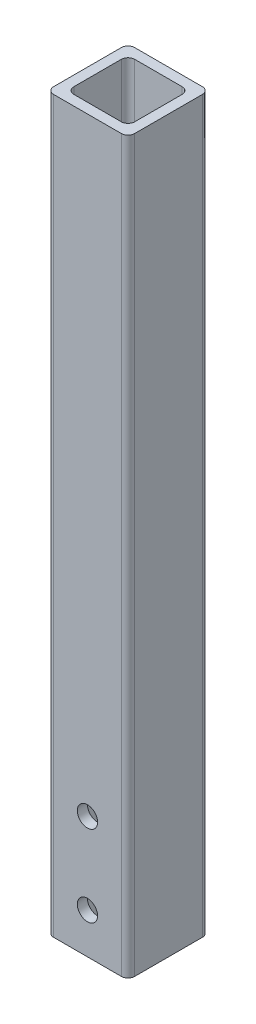
ISO-10303-21;
HEADER;
FILE_DESCRIPTION(('STEP AP214'),'2;1');
FILE_NAME('part.step','',(''),(''),'','','');
FILE_SCHEMA(('AUTOMOTIVE_DESIGN { 1 0 10303 214 1 1 1 1 }'));
ENDSEC;
DATA;
#1=APPLICATION_CONTEXT('core data for automotive mechanical design processes');
#2=APPLICATION_PROTOCOL_DEFINITION('international standard','automotive_design',2000,#1);
#3=PRODUCT_CONTEXT('',#1,'mechanical');
#4=PRODUCT('Part','Part','',(#3));
#5=PRODUCT_RELATED_PRODUCT_CATEGORY('part','',(#4));
#6=PRODUCT_DEFINITION_FORMATION('','',#4);
#7=PRODUCT_DEFINITION_CONTEXT('part definition',#1,'design');
#8=PRODUCT_DEFINITION('design','',#6,#7);
#9=PRODUCT_DEFINITION_SHAPE('','',#8);
#10=(LENGTH_UNIT() NAMED_UNIT(*) SI_UNIT(.MILLI.,.METRE.));
#11=(NAMED_UNIT(*) PLANE_ANGLE_UNIT() SI_UNIT($,.RADIAN.));
#12=(NAMED_UNIT(*) SI_UNIT($,.STERADIAN.) SOLID_ANGLE_UNIT());
#13=UNCERTAINTY_MEASURE_WITH_UNIT(LENGTH_MEASURE(1.E-05),#10,'distance_accuracy_value','');
#14=(GEOMETRIC_REPRESENTATION_CONTEXT(3) GLOBAL_UNCERTAINTY_ASSIGNED_CONTEXT((#13)) GLOBAL_UNIT_ASSIGNED_CONTEXT((#10,
#11,#12)) REPRESENTATION_CONTEXT('',''));
#15=CARTESIAN_POINT('',(0.,0.,0.));
#16=DIRECTION('',(0.,0.,1.));
#17=DIRECTION('',(1.,0.,0.));
#18=AXIS2_PLACEMENT_3D('',#15,#16,#17);
#19=CARTESIAN_POINT('',(-12.7,1219.2,12.7));
#20=DIRECTION('',(1.,0.,0.));
#21=DIRECTION('',(0.,0.,-1.));
#22=AXIS2_PLACEMENT_3D('',#19,#20,#21);
#23=PLANE('',#22);
#24=DIRECTION('',(0.,0.,1.));
#25=VECTOR('',#24,1.);
#26=CARTESIAN_POINT('',(-12.7,228.6,38.3749805952555));
#27=LINE('',#26,#25);
#28=CARTESIAN_POINT('',(-12.7,228.6,-10.5918));
#29=VERTEX_POINT('',#28);
#30=CARTESIAN_POINT('',(-12.7,228.6,10.5918));
#31=VERTEX_POINT('',#30);
#32=EDGE_CURVE('E170',#29,#31,#27,.T.);
#33=ORIENTED_EDGE('',*,*,#32,.F.);
#34=DIRECTION('',(0.,-1.,0.));
#35=VECTOR('',#34,1.);
#36=CARTESIAN_POINT('',(-12.7,1219.2,-10.5918));
#37=LINE('',#36,#35);
#38=CARTESIAN_POINT('',(-12.7,0.,-10.5918));
#39=VERTEX_POINT('',#38);
#40=EDGE_CURVE('E196',#29,#39,#37,.T.);
#41=ORIENTED_EDGE('',*,*,#40,.T.);
#42=DIRECTION('',(0.,0.,1.));
#43=VECTOR('',#42,1.);
#44=CARTESIAN_POINT('',(-12.7,0.,12.7));
#45=LINE('',#44,#43);
#46=CARTESIAN_POINT('',(-12.7,0.,10.5918));
#47=VERTEX_POINT('',#46);
#48=EDGE_CURVE('E430',#39,#47,#45,.T.);
#49=ORIENTED_EDGE('',*,*,#48,.T.);
#50=DIRECTION('',(0.,-1.,0.));
#51=VECTOR('',#50,1.);
#52=CARTESIAN_POINT('',(-12.7,1219.2,10.5918));
#53=LINE('',#52,#51);
#54=EDGE_CURVE('E189',#47,#31,#53,.F.);
#55=ORIENTED_EDGE('',*,*,#54,.T.);
#56=EDGE_LOOP('',(#33,#41,#49,#55));
#57=FACE_BOUND('',#56,.T.);
#58=ADVANCED_FACE('F47',(#57),#23,.F.);
#59=CARTESIAN_POINT('',(12.7,1219.2,12.7));
#60=DIRECTION('',(0.,0.,-1.));
#61=DIRECTION('',(-1.,0.,0.));
#62=AXIS2_PLACEMENT_3D('',#59,#60,#61);
#63=PLANE('',#62);
#64=CARTESIAN_POINT('',(0.,12.7,12.7));
#65=DIRECTION('',(0.,0.,-1.));
#66=DIRECTION('',(-1.,0.,0.));
#67=AXIS2_PLACEMENT_3D('',#64,#65,#66);
#68=CIRCLE('',#67,3.175);
#69=CARTESIAN_POINT('',(3.175,12.7,12.7));
#70=VERTEX_POINT('',#69);
#71=EDGE_CURVE('E171',#70,#70,#68,.T.);
#72=ORIENTED_EDGE('',*,*,#71,.T.);
#73=EDGE_LOOP('',(#72));
#74=FACE_BOUND('',#73,.T.);
#75=CARTESIAN_POINT('',(0.,38.1,12.7));
#76=DIRECTION('',(0.,0.,-1.));
#77=DIRECTION('',(-1.,0.,0.));
#78=AXIS2_PLACEMENT_3D('',#75,#76,#77);
#79=CIRCLE('',#78,3.175);
#80=CARTESIAN_POINT('',(3.175,38.1,12.7));
#81=VERTEX_POINT('',#80);
#82=EDGE_CURVE('E248',#81,#81,#79,.T.);
#83=ORIENTED_EDGE('',*,*,#82,.T.);
#84=EDGE_LOOP('',(#83));
#85=FACE_BOUND('',#84,.T.);
#86=DIRECTION('',(1.,0.,0.));
#87=VECTOR('',#86,1.);
#88=CARTESIAN_POINT('',(12.7,228.6,12.7));
#89=LINE('',#88,#87);
#90=CARTESIAN_POINT('',(-10.5918,228.6,12.7));
#91=VERTEX_POINT('',#90);
#92=CARTESIAN_POINT('',(10.5918,228.6,12.7));
#93=VERTEX_POINT('',#92);
#94=EDGE_CURVE('E74',#91,#93,#89,.T.);
#95=ORIENTED_EDGE('',*,*,#94,.F.);
#96=DIRECTION('',(0.,-1.,0.));
#97=VECTOR('',#96,1.);
#98=CARTESIAN_POINT('',(-10.5918,1219.2,12.7));
#99=LINE('',#98,#97);
#100=CARTESIAN_POINT('',(-10.5918,0.,12.7));
#101=VERTEX_POINT('',#100);
#102=EDGE_CURVE('E285',#91,#101,#99,.T.);
#103=ORIENTED_EDGE('',*,*,#102,.T.);
#104=DIRECTION('',(1.,0.,0.));
#105=VECTOR('',#104,1.);
#106=CARTESIAN_POINT('',(12.7,0.,12.7));
#107=LINE('',#106,#105);
#108=CARTESIAN_POINT('',(10.5918,0.,12.7));
#109=VERTEX_POINT('',#108);
#110=EDGE_CURVE('E434',#101,#109,#107,.T.);
#111=ORIENTED_EDGE('',*,*,#110,.T.);
#112=DIRECTION('',(0.,-1.,0.));
#113=VECTOR('',#112,1.);
#114=CARTESIAN_POINT('',(10.5918,1219.2,12.7));
#115=LINE('',#114,#113);
#116=EDGE_CURVE('E207',#109,#93,#115,.F.);
#117=ORIENTED_EDGE('',*,*,#116,.T.);
#118=EDGE_LOOP('',(#95,#103,#111,#117));
#119=FACE_BOUND('',#118,.T.);
#120=ADVANCED_FACE('F479',(#74,#85,#119),#63,.F.);
#121=CARTESIAN_POINT('',(12.7,1219.2,12.7));
#122=DIRECTION('',(-1.,0.,0.));
#123=DIRECTION('',(0.,0.,1.));
#124=AXIS2_PLACEMENT_3D('',#121,#122,#123);
#125=PLANE('',#124);
#126=DIRECTION('',(0.,0.,1.));
#127=VECTOR('',#126,1.);
#128=CARTESIAN_POINT('',(12.7,228.6,38.3749805952555));
#129=LINE('',#128,#127);
#130=CARTESIAN_POINT('',(12.7,228.6,-10.5918));
#131=VERTEX_POINT('',#130);
#132=CARTESIAN_POINT('',(12.7,228.6,10.5918));
#133=VERTEX_POINT('',#132);
#134=EDGE_CURVE('E161',#131,#133,#129,.T.);
#135=ORIENTED_EDGE('',*,*,#134,.T.);
#136=DIRECTION('',(0.,-1.,0.));
#137=VECTOR('',#136,1.);
#138=CARTESIAN_POINT('',(12.7,1219.2,10.5918));
#139=LINE('',#138,#137);
#140=CARTESIAN_POINT('',(12.7,0.,10.5918));
#141=VERTEX_POINT('',#140);
#142=EDGE_CURVE('E190',#133,#141,#139,.T.);
#143=ORIENTED_EDGE('',*,*,#142,.T.);
#144=DIRECTION('',(0.,0.,-1.));
#145=VECTOR('',#144,1.);
#146=CARTESIAN_POINT('',(12.7,0.,12.7));
#147=LINE('',#146,#145);
#148=CARTESIAN_POINT('',(12.7,0.,-10.5918));
#149=VERTEX_POINT('',#148);
#150=EDGE_CURVE('E187',#141,#149,#147,.T.);
#151=ORIENTED_EDGE('',*,*,#150,.T.);
#152=DIRECTION('',(0.,-1.,0.));
#153=VECTOR('',#152,1.);
#154=CARTESIAN_POINT('',(12.7,1219.2,-10.5918));
#155=LINE('',#154,#153);
#156=EDGE_CURVE('E178',#149,#131,#155,.F.);
#157=ORIENTED_EDGE('',*,*,#156,.T.);
#158=EDGE_LOOP('',(#135,#143,#151,#157));
#159=FACE_BOUND('',#158,.T.);
#160=ADVANCED_FACE('F185',(#159),#125,.F.);
#161=CARTESIAN_POINT('',(12.7,1219.2,-12.7));
#162=DIRECTION('',(0.,0.,1.));
#163=DIRECTION('',(1.,0.,0.));
#164=AXIS2_PLACEMENT_3D('',#161,#162,#163);
#165=PLANE('',#164);
#166=CARTESIAN_POINT('',(0.,12.7,-12.7));
#167=DIRECTION('',(0.,0.,1.));
#168=DIRECTION('',(1.,0.,0.));
#169=AXIS2_PLACEMENT_3D('',#166,#167,#168);
#170=CIRCLE('',#169,3.175);
#171=CARTESIAN_POINT('',(3.175,12.7,-12.7));
#172=VERTEX_POINT('',#171);
#173=EDGE_CURVE('E227',#172,#172,#170,.T.);
#174=ORIENTED_EDGE('',*,*,#173,.T.);
#175=EDGE_LOOP('',(#174));
#176=FACE_BOUND('',#175,.T.);
#177=CARTESIAN_POINT('',(0.,38.1,-12.7));
#178=DIRECTION('',(0.,0.,1.));
#179=DIRECTION('',(1.,0.,0.));
#180=AXIS2_PLACEMENT_3D('',#177,#178,#179);
#181=CIRCLE('',#180,3.175);
#182=CARTESIAN_POINT('',(3.175,38.1,-12.7));
#183=VERTEX_POINT('',#182);
#184=EDGE_CURVE('E233',#183,#183,#181,.T.);
#185=ORIENTED_EDGE('',*,*,#184,.T.);
#186=EDGE_LOOP('',(#185));
#187=FACE_BOUND('',#186,.T.);
#188=DIRECTION('',(-1.,0.,0.));
#189=VECTOR('',#188,1.);
#190=CARTESIAN_POINT('',(12.7,228.6,-12.7));
#191=LINE('',#190,#189);
#192=CARTESIAN_POINT('',(10.5918,228.6,-12.7));
#193=VERTEX_POINT('',#192);
#194=CARTESIAN_POINT('',(-10.5918,228.6,-12.7));
#195=VERTEX_POINT('',#194);
#196=EDGE_CURVE('E182',#193,#195,#191,.T.);
#197=ORIENTED_EDGE('',*,*,#196,.F.);
#198=DIRECTION('',(0.,-1.,0.));
#199=VECTOR('',#198,1.);
#200=CARTESIAN_POINT('',(10.5918,1219.2,-12.7));
#201=LINE('',#200,#199);
#202=CARTESIAN_POINT('',(10.5918,0.,-12.7));
#203=VERTEX_POINT('',#202);
#204=EDGE_CURVE('E179',#193,#203,#201,.T.);
#205=ORIENTED_EDGE('',*,*,#204,.T.);
#206=DIRECTION('',(-1.,0.,0.));
#207=VECTOR('',#206,1.);
#208=CARTESIAN_POINT('',(12.7,0.,-12.7));
#209=LINE('',#208,#207);
#210=CARTESIAN_POINT('',(-10.5918,0.,-12.7));
#211=VERTEX_POINT('',#210);
#212=EDGE_CURVE('E374',#203,#211,#209,.T.);
#213=ORIENTED_EDGE('',*,*,#212,.T.);
#214=DIRECTION('',(0.,-1.,0.));
#215=VECTOR('',#214,1.);
#216=CARTESIAN_POINT('',(-10.5918,1219.2,-12.7));
#217=LINE('',#216,#215);
#218=EDGE_CURVE('E275',#211,#195,#217,.F.);
#219=ORIENTED_EDGE('',*,*,#218,.T.);
#220=EDGE_LOOP('',(#197,#205,#213,#219));
#221=FACE_BOUND('',#220,.T.);
#222=ADVANCED_FACE('F372',(#176,#187,#221),#165,.F.);
#223=CARTESIAN_POINT('',(9.525,1219.2,9.525));
#224=DIRECTION('',(-1.,0.,0.));
#225=DIRECTION('',(0.,0.,1.));
#226=AXIS2_PLACEMENT_3D('',#223,#224,#225);
#227=PLANE('',#226);
#228=DIRECTION('',(0.,-1.,0.));
#229=VECTOR('',#228,1.);
#230=CARTESIAN_POINT('',(9.525,1219.2,7.4168));
#231=LINE('',#230,#229);
#232=CARTESIAN_POINT('',(9.525,0.,7.4168));
#233=VERTEX_POINT('',#232);
#234=CARTESIAN_POINT('',(9.525,228.6,7.4168));
#235=VERTEX_POINT('',#234);
#236=EDGE_CURVE('E442',#233,#235,#231,.F.);
#237=ORIENTED_EDGE('',*,*,#236,.T.);
#238=DIRECTION('',(0.,0.,-1.));
#239=VECTOR('',#238,1.);
#240=CARTESIAN_POINT('',(9.525,228.6,9.525));
#241=LINE('',#240,#239);
#242=CARTESIAN_POINT('',(9.525,228.6,-7.4168));
#243=VERTEX_POINT('',#242);
#244=EDGE_CURVE('E66',#235,#243,#241,.T.);
#245=ORIENTED_EDGE('',*,*,#244,.T.);
#246=DIRECTION('',(0.,-1.,0.));
#247=VECTOR('',#246,1.);
#248=CARTESIAN_POINT('',(9.525,0.,-7.4168));
#249=LINE('',#248,#247);
#250=CARTESIAN_POINT('',(9.525,0.,-7.4168));
#251=VERTEX_POINT('',#250);
#252=EDGE_CURVE('E348',#243,#251,#249,.T.);
#253=ORIENTED_EDGE('',*,*,#252,.T.);
#254=DIRECTION('',(0.,0.,-1.));
#255=VECTOR('',#254,1.);
#256=CARTESIAN_POINT('',(9.525,0.,9.525));
#257=LINE('',#256,#255);
#258=EDGE_CURVE('E416',#233,#251,#257,.T.);
#259=ORIENTED_EDGE('',*,*,#258,.F.);
#260=EDGE_LOOP('',(#237,#245,#253,#259));
#261=FACE_BOUND('',#260,.T.);
#262=ADVANCED_FACE('F324',(#261),#227,.T.);
#263=CARTESIAN_POINT('',(9.525,1219.2,-9.525));
#264=DIRECTION('',(0.,0.,1.));
#265=DIRECTION('',(1.,0.,0.));
#266=AXIS2_PLACEMENT_3D('',#263,#264,#265);
#267=PLANE('',#266);
#268=CARTESIAN_POINT('',(0.,12.7,-9.525));
#269=DIRECTION('',(0.,0.,1.));
#270=DIRECTION('',(1.,0.,0.));
#271=AXIS2_PLACEMENT_3D('',#268,#269,#270);
#272=CIRCLE('',#271,3.175);
#273=CARTESIAN_POINT('',(3.175,12.7,-9.525));
#274=VERTEX_POINT('',#273);
#275=EDGE_CURVE('E254',#274,#274,#272,.T.);
#276=ORIENTED_EDGE('',*,*,#275,.F.);
#277=EDGE_LOOP('',(#276));
#278=FACE_BOUND('',#277,.T.);
#279=CARTESIAN_POINT('',(0.,38.1,-9.525));
#280=DIRECTION('',(0.,0.,1.));
#281=DIRECTION('',(1.,0.,0.));
#282=AXIS2_PLACEMENT_3D('',#279,#280,#281);
#283=CIRCLE('',#282,3.175);
#284=CARTESIAN_POINT('',(3.175,38.1,-9.525));
#285=VERTEX_POINT('',#284);
#286=EDGE_CURVE('E253',#285,#285,#283,.T.);
#287=ORIENTED_EDGE('',*,*,#286,.F.);
#288=EDGE_LOOP('',(#287));
#289=FACE_BOUND('',#288,.T.);
#290=DIRECTION('',(0.,-1.,0.));
#291=VECTOR('',#290,1.);
#292=CARTESIAN_POINT('',(7.4168,1219.2,-9.525));
#293=LINE('',#292,#291);
#294=CARTESIAN_POINT('',(7.4168,0.,-9.525));
#295=VERTEX_POINT('',#294);
#296=CARTESIAN_POINT('',(7.4168,228.6,-9.525));
#297=VERTEX_POINT('',#296);
#298=EDGE_CURVE('E331',#295,#297,#293,.F.);
#299=ORIENTED_EDGE('',*,*,#298,.T.);
#300=DIRECTION('',(-1.,0.,0.));
#301=VECTOR('',#300,1.);
#302=CARTESIAN_POINT('',(9.525,228.6,-9.525));
#303=LINE('',#302,#301);
#304=CARTESIAN_POINT('',(-7.41679999999999,228.6,-9.525));
#305=VERTEX_POINT('',#304);
#306=EDGE_CURVE('E332',#297,#305,#303,.T.);
#307=ORIENTED_EDGE('',*,*,#306,.T.);
#308=DIRECTION('',(0.,-1.,0.));
#309=VECTOR('',#308,1.);
#310=CARTESIAN_POINT('',(-7.4168,0.,-9.525));
#311=LINE('',#310,#309);
#312=CARTESIAN_POINT('',(-7.4168,0.,-9.525));
#313=VERTEX_POINT('',#312);
#314=EDGE_CURVE('E341',#305,#313,#311,.T.);
#315=ORIENTED_EDGE('',*,*,#314,.T.);
#316=DIRECTION('',(-1.,0.,0.));
#317=VECTOR('',#316,1.);
#318=CARTESIAN_POINT('',(9.525,0.,-9.525));
#319=LINE('',#318,#317);
#320=EDGE_CURVE('E335',#295,#313,#319,.T.);
#321=ORIENTED_EDGE('',*,*,#320,.F.);
#322=EDGE_LOOP('',(#299,#307,#315,#321));
#323=FACE_BOUND('',#322,.T.);
#324=ADVANCED_FACE('F320',(#278,#289,#323),#267,.T.);
#325=CARTESIAN_POINT('',(-9.525,1219.2,9.525));
#326=DIRECTION('',(1.,0.,0.));
#327=DIRECTION('',(0.,0.,-1.));
#328=AXIS2_PLACEMENT_3D('',#325,#326,#327);
#329=PLANE('',#328);
#330=DIRECTION('',(0.,-1.,0.));
#331=VECTOR('',#330,1.);
#332=CARTESIAN_POINT('',(-9.525,1219.2,-7.4168));
#333=LINE('',#332,#331);
#334=CARTESIAN_POINT('',(-9.525,0.,-7.4168));
#335=VERTEX_POINT('',#334);
#336=CARTESIAN_POINT('',(-9.525,228.6,-7.41679999999999));
#337=VERTEX_POINT('',#336);
#338=EDGE_CURVE('E346',#335,#337,#333,.F.);
#339=ORIENTED_EDGE('',*,*,#338,.T.);
#340=DIRECTION('',(0.,0.,1.));
#341=VECTOR('',#340,1.);
#342=CARTESIAN_POINT('',(-9.525,228.6,9.525));
#343=LINE('',#342,#341);
#344=CARTESIAN_POINT('',(-9.52500000000001,228.6,7.4168));
#345=VERTEX_POINT('',#344);
#346=EDGE_CURVE('E407',#337,#345,#343,.T.);
#347=ORIENTED_EDGE('',*,*,#346,.T.);
#348=DIRECTION('',(0.,-1.,0.));
#349=VECTOR('',#348,1.);
#350=CARTESIAN_POINT('',(-9.525,0.,7.4168));
#351=LINE('',#350,#349);
#352=CARTESIAN_POINT('',(-9.525,0.,7.4168));
#353=VERTEX_POINT('',#352);
#354=EDGE_CURVE('E340',#345,#353,#351,.T.);
#355=ORIENTED_EDGE('',*,*,#354,.T.);
#356=DIRECTION('',(0.,0.,1.));
#357=VECTOR('',#356,1.);
#358=CARTESIAN_POINT('',(-9.525,0.,9.525));
#359=LINE('',#358,#357);
#360=EDGE_CURVE('E422',#335,#353,#359,.T.);
#361=ORIENTED_EDGE('',*,*,#360,.F.);
#362=EDGE_LOOP('',(#339,#347,#355,#361));
#363=FACE_BOUND('',#362,.T.);
#364=ADVANCED_FACE('F323',(#363),#329,.T.);
#365=CARTESIAN_POINT('',(9.525,1219.2,9.525));
#366=DIRECTION('',(0.,0.,-1.));
#367=DIRECTION('',(-1.,0.,0.));
#368=AXIS2_PLACEMENT_3D('',#365,#366,#367);
#369=PLANE('',#368);
#370=CARTESIAN_POINT('',(0.,12.7,9.52499999999999));
#371=DIRECTION('',(0.,0.,-1.));
#372=DIRECTION('',(-1.,0.,0.));
#373=AXIS2_PLACEMENT_3D('',#370,#371,#372);
#374=CIRCLE('',#373,3.175);
#375=CARTESIAN_POINT('',(3.175,12.7,9.52499999999999));
#376=VERTEX_POINT('',#375);
#377=EDGE_CURVE('E51',#376,#376,#374,.T.);
#378=ORIENTED_EDGE('',*,*,#377,.F.);
#379=EDGE_LOOP('',(#378));
#380=FACE_BOUND('',#379,.T.);
#381=CARTESIAN_POINT('',(0.,38.1,9.52499999999999));
#382=DIRECTION('',(0.,0.,-1.));
#383=DIRECTION('',(-1.,0.,0.));
#384=AXIS2_PLACEMENT_3D('',#381,#382,#383);
#385=CIRCLE('',#384,3.175);
#386=CARTESIAN_POINT('',(3.175,38.1,9.52499999999999));
#387=VERTEX_POINT('',#386);
#388=EDGE_CURVE('E232',#387,#387,#385,.T.);
#389=ORIENTED_EDGE('',*,*,#388,.F.);
#390=EDGE_LOOP('',(#389));
#391=FACE_BOUND('',#390,.T.);
#392=DIRECTION('',(0.,-1.,0.));
#393=VECTOR('',#392,1.);
#394=CARTESIAN_POINT('',(-7.4168,1219.2,9.525));
#395=LINE('',#394,#393);
#396=CARTESIAN_POINT('',(-7.4168,0.,9.525));
#397=VERTEX_POINT('',#396);
#398=CARTESIAN_POINT('',(-7.4168,228.6,9.525));
#399=VERTEX_POINT('',#398);
#400=EDGE_CURVE('E357',#397,#399,#395,.F.);
#401=ORIENTED_EDGE('',*,*,#400,.T.);
#402=DIRECTION('',(1.,0.,0.));
#403=VECTOR('',#402,1.);
#404=CARTESIAN_POINT('',(9.525,228.6,9.525));
#405=LINE('',#404,#403);
#406=CARTESIAN_POINT('',(7.4168,228.6,9.525));
#407=VERTEX_POINT('',#406);
#408=EDGE_CURVE('E396',#399,#407,#405,.T.);
#409=ORIENTED_EDGE('',*,*,#408,.T.);
#410=DIRECTION('',(0.,-1.,0.));
#411=VECTOR('',#410,1.);
#412=CARTESIAN_POINT('',(7.4168,0.,9.525));
#413=LINE('',#412,#411);
#414=CARTESIAN_POINT('',(7.4168,0.,9.525));
#415=VERTEX_POINT('',#414);
#416=EDGE_CURVE('E355',#407,#415,#413,.T.);
#417=ORIENTED_EDGE('',*,*,#416,.T.);
#418=DIRECTION('',(1.,0.,0.));
#419=VECTOR('',#418,1.);
#420=CARTESIAN_POINT('',(9.525,0.,9.525));
#421=LINE('',#420,#419);
#422=EDGE_CURVE('E426',#397,#415,#421,.T.);
#423=ORIENTED_EDGE('',*,*,#422,.F.);
#424=EDGE_LOOP('',(#401,#409,#417,#423));
#425=FACE_BOUND('',#424,.T.);
#426=ADVANCED_FACE('F458',(#380,#391,#425),#369,.T.);
#427=CARTESIAN_POINT('',(7.4168,1219.2,-7.4168));
#428=DIRECTION('',(0.,1.,0.));
#429=DIRECTION('',(0.,0.,1.));
#430=AXIS2_PLACEMENT_3D('',#427,#428,#429);
#431=CYLINDRICAL_SURFACE('',#430,2.1082);
#432=CARTESIAN_POINT('',(7.4168,228.6,-7.4168));
#433=DIRECTION('',(0.,1.,0.));
#434=DIRECTION('',(0.,0.,1.));
#435=AXIS2_PLACEMENT_3D('',#432,#433,#434);
#436=CIRCLE('',#435,2.1082);
#437=EDGE_CURVE('E404',#297,#243,#436,.F.);
#438=ORIENTED_EDGE('',*,*,#437,.F.);
#439=ORIENTED_EDGE('',*,*,#298,.F.);
#440=CARTESIAN_POINT('',(7.4168,0.,-7.4168));
#441=DIRECTION('',(0.,1.,0.));
#442=DIRECTION('',(0.,0.,1.));
#443=AXIS2_PLACEMENT_3D('',#440,#441,#442);
#444=CIRCLE('',#443,2.1082);
#445=EDGE_CURVE('E289',#251,#295,#444,.T.);
#446=ORIENTED_EDGE('',*,*,#445,.F.);
#447=ORIENTED_EDGE('',*,*,#252,.F.);
#448=EDGE_LOOP('',(#438,#439,#446,#447));
#449=FACE_BOUND('',#448,.T.);
#450=ADVANCED_FACE('F450',(#449),#431,.F.);
#451=CARTESIAN_POINT('',(-7.4168,1219.2,-7.4168));
#452=DIRECTION('',(0.,1.,0.));
#453=DIRECTION('',(0.,0.,1.));
#454=AXIS2_PLACEMENT_3D('',#451,#452,#453);
#455=CYLINDRICAL_SURFACE('',#454,2.1082);
#456=CARTESIAN_POINT('',(-7.4168,228.6,-7.4168));
#457=DIRECTION('',(0.,1.,0.));
#458=DIRECTION('',(0.,0.,1.));
#459=AXIS2_PLACEMENT_3D('',#456,#457,#458);
#460=CIRCLE('',#459,2.1082);
#461=EDGE_CURVE('E413',#337,#305,#460,.F.);
#462=ORIENTED_EDGE('',*,*,#461,.F.);
#463=ORIENTED_EDGE('',*,*,#338,.F.);
#464=CARTESIAN_POINT('',(-7.4168,0.,-7.4168));
#465=DIRECTION('',(0.,1.,0.));
#466=DIRECTION('',(0.,0.,1.));
#467=AXIS2_PLACEMENT_3D('',#464,#465,#466);
#468=CIRCLE('',#467,2.1082);
#469=EDGE_CURVE('E296',#313,#335,#468,.T.);
#470=ORIENTED_EDGE('',*,*,#469,.F.);
#471=ORIENTED_EDGE('',*,*,#314,.F.);
#472=EDGE_LOOP('',(#462,#463,#470,#471));
#473=FACE_BOUND('',#472,.T.);
#474=ADVANCED_FACE('F469',(#473),#455,.F.);
#475=CARTESIAN_POINT('',(-7.4168,1219.2,7.4168));
#476=DIRECTION('',(0.,1.,0.));
#477=DIRECTION('',(0.,0.,1.));
#478=AXIS2_PLACEMENT_3D('',#475,#476,#477);
#479=CYLINDRICAL_SURFACE('',#478,2.1082);
#480=CARTESIAN_POINT('',(-7.4168,228.6,7.4168));
#481=DIRECTION('',(0.,1.,0.));
#482=DIRECTION('',(0.,0.,1.));
#483=AXIS2_PLACEMENT_3D('',#480,#481,#482);
#484=CIRCLE('',#483,2.1082);
#485=EDGE_CURVE('E401',#399,#345,#484,.F.);
#486=ORIENTED_EDGE('',*,*,#485,.F.);
#487=ORIENTED_EDGE('',*,*,#400,.F.);
#488=CARTESIAN_POINT('',(-7.4168,0.,7.4168));
#489=DIRECTION('',(0.,1.,0.));
#490=DIRECTION('',(0.,0.,1.));
#491=AXIS2_PLACEMENT_3D('',#488,#489,#490);
#492=CIRCLE('',#491,2.1082);
#493=EDGE_CURVE('E299',#353,#397,#492,.T.);
#494=ORIENTED_EDGE('',*,*,#493,.F.);
#495=ORIENTED_EDGE('',*,*,#354,.F.);
#496=EDGE_LOOP('',(#486,#487,#494,#495));
#497=FACE_BOUND('',#496,.T.);
#498=ADVANCED_FACE('F461',(#497),#479,.F.);
#499=CARTESIAN_POINT('',(7.4168,1219.2,7.4168));
#500=DIRECTION('',(0.,1.,0.));
#501=DIRECTION('',(0.,0.,1.));
#502=AXIS2_PLACEMENT_3D('',#499,#500,#501);
#503=CYLINDRICAL_SURFACE('',#502,2.1082);
#504=CARTESIAN_POINT('',(7.4168,228.6,7.4168));
#505=DIRECTION('',(0.,1.,0.));
#506=DIRECTION('',(0.,0.,1.));
#507=AXIS2_PLACEMENT_3D('',#504,#505,#506);
#508=CIRCLE('',#507,2.1082);
#509=EDGE_CURVE('E181',#235,#407,#508,.F.);
#510=ORIENTED_EDGE('',*,*,#509,.F.);
#511=ORIENTED_EDGE('',*,*,#236,.F.);
#512=CARTESIAN_POINT('',(7.4168,0.,7.4168));
#513=DIRECTION('',(0.,1.,0.));
#514=DIRECTION('',(0.,0.,1.));
#515=AXIS2_PLACEMENT_3D('',#512,#513,#514);
#516=CIRCLE('',#515,2.1082);
#517=EDGE_CURVE('E58',#415,#233,#516,.T.);
#518=ORIENTED_EDGE('',*,*,#517,.F.);
#519=ORIENTED_EDGE('',*,*,#416,.F.);
#520=EDGE_LOOP('',(#510,#511,#518,#519));
#521=FACE_BOUND('',#520,.T.);
#522=ADVANCED_FACE('F456',(#521),#503,.F.);
#523=CARTESIAN_POINT('',(10.5918,1219.2,-10.5918));
#524=DIRECTION('',(0.,-1.,0.));
#525=DIRECTION('',(0.,0.,-1.));
#526=AXIS2_PLACEMENT_3D('',#523,#524,#525);
#527=CYLINDRICAL_SURFACE('',#526,2.1082);
#528=ORIENTED_EDGE('',*,*,#204,.F.);
#529=CARTESIAN_POINT('',(10.5918,228.6,-10.5918));
#530=DIRECTION('',(0.,1.,0.));
#531=DIRECTION('',(0.,0.,1.));
#532=AXIS2_PLACEMENT_3D('',#529,#530,#531);
#533=CIRCLE('',#532,2.1082);
#534=EDGE_CURVE('E164',#193,#131,#533,.F.);
#535=ORIENTED_EDGE('',*,*,#534,.T.);
#536=ORIENTED_EDGE('',*,*,#156,.F.);
#537=CARTESIAN_POINT('',(10.5918,0.,-10.5918));
#538=DIRECTION('',(0.,1.,0.));
#539=DIRECTION('',(0.,0.,1.));
#540=AXIS2_PLACEMENT_3D('',#537,#538,#539);
#541=CIRCLE('',#540,2.1082);
#542=EDGE_CURVE('E199',#203,#149,#541,.F.);
#543=ORIENTED_EDGE('',*,*,#542,.F.);
#544=EDGE_LOOP('',(#528,#535,#536,#543));
#545=FACE_BOUND('',#544,.T.);
#546=ADVANCED_FACE('F176',(#545),#527,.T.);
#547=CARTESIAN_POINT('',(-10.5918,1219.2,-10.5918));
#548=DIRECTION('',(0.,-1.,0.));
#549=DIRECTION('',(0.,0.,-1.));
#550=AXIS2_PLACEMENT_3D('',#547,#548,#549);
#551=CYLINDRICAL_SURFACE('',#550,2.1082);
#552=ORIENTED_EDGE('',*,*,#40,.F.);
#553=CARTESIAN_POINT('',(-10.5918,228.6,-10.5918));
#554=DIRECTION('',(0.,1.,0.));
#555=DIRECTION('',(0.,0.,1.));
#556=AXIS2_PLACEMENT_3D('',#553,#554,#555);
#557=CIRCLE('',#556,2.1082);
#558=EDGE_CURVE('E382',#29,#195,#557,.F.);
#559=ORIENTED_EDGE('',*,*,#558,.T.);
#560=ORIENTED_EDGE('',*,*,#218,.F.);
#561=CARTESIAN_POINT('',(-10.5918,0.,-10.5918));
#562=DIRECTION('',(0.,1.,0.));
#563=DIRECTION('',(0.,0.,1.));
#564=AXIS2_PLACEMENT_3D('',#561,#562,#563);
#565=CIRCLE('',#564,2.1082);
#566=EDGE_CURVE('E380',#39,#211,#565,.F.);
#567=ORIENTED_EDGE('',*,*,#566,.F.);
#568=EDGE_LOOP('',(#552,#559,#560,#567));
#569=FACE_BOUND('',#568,.T.);
#570=ADVANCED_FACE('F379',(#569),#551,.T.);
#571=CARTESIAN_POINT('',(-10.5918,1219.2,10.5918));
#572=DIRECTION('',(0.,-1.,0.));
#573=DIRECTION('',(0.,0.,-1.));
#574=AXIS2_PLACEMENT_3D('',#571,#572,#573);
#575=CYLINDRICAL_SURFACE('',#574,2.1082);
#576=ORIENTED_EDGE('',*,*,#102,.F.);
#577=CARTESIAN_POINT('',(-10.5918,228.6,10.5918));
#578=DIRECTION('',(0.,1.,0.));
#579=DIRECTION('',(0.,0.,1.));
#580=AXIS2_PLACEMENT_3D('',#577,#578,#579);
#581=CIRCLE('',#580,2.1082);
#582=EDGE_CURVE('E385',#91,#31,#581,.F.);
#583=ORIENTED_EDGE('',*,*,#582,.T.);
#584=ORIENTED_EDGE('',*,*,#54,.F.);
#585=CARTESIAN_POINT('',(-10.5918,0.,10.5918));
#586=DIRECTION('',(0.,1.,0.));
#587=DIRECTION('',(0.,0.,1.));
#588=AXIS2_PLACEMENT_3D('',#585,#586,#587);
#589=CIRCLE('',#588,2.1082);
#590=EDGE_CURVE('E584',#101,#47,#589,.F.);
#591=ORIENTED_EDGE('',*,*,#590,.F.);
#592=EDGE_LOOP('',(#576,#583,#584,#591));
#593=FACE_BOUND('',#592,.T.);
#594=ADVANCED_FACE('F581',(#593),#575,.T.);
#595=CARTESIAN_POINT('',(10.5918,1219.2,10.5918));
#596=DIRECTION('',(0.,-1.,0.));
#597=DIRECTION('',(0.,0.,-1.));
#598=AXIS2_PLACEMENT_3D('',#595,#596,#597);
#599=CYLINDRICAL_SURFACE('',#598,2.1082);
#600=ORIENTED_EDGE('',*,*,#142,.F.);
#601=CARTESIAN_POINT('',(10.5918,228.6,10.5918));
#602=DIRECTION('',(0.,1.,0.));
#603=DIRECTION('',(0.,0.,1.));
#604=AXIS2_PLACEMENT_3D('',#601,#602,#603);
#605=CIRCLE('',#604,2.1082);
#606=EDGE_CURVE('E13',#133,#93,#605,.F.);
#607=ORIENTED_EDGE('',*,*,#606,.T.);
#608=ORIENTED_EDGE('',*,*,#116,.F.);
#609=CARTESIAN_POINT('',(10.5918,0.,10.5918));
#610=DIRECTION('',(0.,1.,0.));
#611=DIRECTION('',(0.,0.,1.));
#612=AXIS2_PLACEMENT_3D('',#609,#610,#611);
#613=CIRCLE('',#612,2.1082);
#614=EDGE_CURVE('E274',#141,#109,#613,.F.);
#615=ORIENTED_EDGE('',*,*,#614,.F.);
#616=EDGE_LOOP('',(#600,#607,#608,#615));
#617=FACE_BOUND('',#616,.T.);
#618=ADVANCED_FACE('F49',(#617),#599,.T.);
#619=CARTESIAN_POINT('',(0.,0.,0.));
#620=DIRECTION('',(0.,1.,0.));
#621=DIRECTION('',(0.,0.,1.));
#622=AXIS2_PLACEMENT_3D('',#619,#620,#621);
#623=PLANE('',#622);
#624=ORIENTED_EDGE('',*,*,#212,.F.);
#625=ORIENTED_EDGE('',*,*,#542,.T.);
#626=ORIENTED_EDGE('',*,*,#150,.F.);
#627=ORIENTED_EDGE('',*,*,#614,.T.);
#628=ORIENTED_EDGE('',*,*,#110,.F.);
#629=ORIENTED_EDGE('',*,*,#590,.T.);
#630=ORIENTED_EDGE('',*,*,#48,.F.);
#631=ORIENTED_EDGE('',*,*,#566,.T.);
#632=EDGE_LOOP('',(#624,#625,#626,#627,#628,#629,#630,#631));
#633=FACE_BOUND('',#632,.T.);
#634=ORIENTED_EDGE('',*,*,#422,.T.);
#635=ORIENTED_EDGE('',*,*,#517,.T.);
#636=ORIENTED_EDGE('',*,*,#258,.T.);
#637=ORIENTED_EDGE('',*,*,#445,.T.);
#638=ORIENTED_EDGE('',*,*,#320,.T.);
#639=ORIENTED_EDGE('',*,*,#469,.T.);
#640=ORIENTED_EDGE('',*,*,#360,.T.);
#641=ORIENTED_EDGE('',*,*,#493,.T.);
#642=EDGE_LOOP('',(#634,#635,#636,#637,#638,#639,#640,#641));
#643=FACE_BOUND('',#642,.T.);
#644=ADVANCED_FACE('F452',(#633,#643),#623,.F.);
#645=CARTESIAN_POINT('',(-12.7,228.6,38.3749805952555));
#646=DIRECTION('',(0.,1.,0.));
#647=DIRECTION('',(0.,0.,1.));
#648=AXIS2_PLACEMENT_3D('',#645,#646,#647);
#649=PLANE('',#648);
#650=ORIENTED_EDGE('',*,*,#196,.T.);
#651=ORIENTED_EDGE('',*,*,#558,.F.);
#652=ORIENTED_EDGE('',*,*,#32,.T.);
#653=ORIENTED_EDGE('',*,*,#582,.F.);
#654=ORIENTED_EDGE('',*,*,#94,.T.);
#655=ORIENTED_EDGE('',*,*,#606,.F.);
#656=ORIENTED_EDGE('',*,*,#134,.F.);
#657=ORIENTED_EDGE('',*,*,#534,.F.);
#658=EDGE_LOOP('',(#650,#651,#652,#653,#654,#655,#656,#657));
#659=FACE_BOUND('',#658,.T.);
#660=ORIENTED_EDGE('',*,*,#461,.T.);
#661=ORIENTED_EDGE('',*,*,#306,.F.);
#662=ORIENTED_EDGE('',*,*,#437,.T.);
#663=ORIENTED_EDGE('',*,*,#244,.F.);
#664=ORIENTED_EDGE('',*,*,#509,.T.);
#665=ORIENTED_EDGE('',*,*,#408,.F.);
#666=ORIENTED_EDGE('',*,*,#485,.T.);
#667=ORIENTED_EDGE('',*,*,#346,.F.);
#668=EDGE_LOOP('',(#660,#661,#662,#663,#664,#665,#666,#667));
#669=FACE_BOUND('',#668,.T.);
#670=ADVANCED_FACE('F163',(#659,#669),#649,.T.);
#671=CARTESIAN_POINT('',(0.,38.1,-12.7));
#672=DIRECTION('',(0.,0.,1.));
#673=DIRECTION('',(1.,0.,0.));
#674=AXIS2_PLACEMENT_3D('',#671,#672,#673);
#675=CYLINDRICAL_SURFACE('',#674,3.175);
#676=CARTESIAN_POINT('',(3.175,38.1,9.52499999999999));
#677=CARTESIAN_POINT('',(3.175,38.1,9.55807291666666));
#678=CARTESIAN_POINT('',(3.175,38.1,9.59114583333333));
#679=CARTESIAN_POINT('',(3.175,38.1,9.65729166666666));
#680=CARTESIAN_POINT('',(3.175,38.1,9.69036458333333));
#681=CARTESIAN_POINT('',(3.175,38.1,9.75651041666666));
#682=CARTESIAN_POINT('',(3.175,38.1,9.78958333333333));
#683=CARTESIAN_POINT('',(3.175,38.1,9.85572916666666));
#684=CARTESIAN_POINT('',(3.175,38.1,9.88880208333333));
#685=CARTESIAN_POINT('',(3.175,38.1,9.95494791666666));
#686=CARTESIAN_POINT('',(3.175,38.1,9.98802083333333));
#687=CARTESIAN_POINT('',(3.175,38.1,10.0541666666667));
#688=CARTESIAN_POINT('',(3.175,38.1,10.0872395833333));
#689=CARTESIAN_POINT('',(3.175,38.1,10.1533854166667));
#690=CARTESIAN_POINT('',(3.175,38.1,10.1864583333333));
#691=CARTESIAN_POINT('',(3.175,38.1,10.2526041666667));
#692=CARTESIAN_POINT('',(3.175,38.1,10.2856770833333));
#693=CARTESIAN_POINT('',(3.175,38.1,10.3518229166667));
#694=CARTESIAN_POINT('',(3.175,38.1,10.3848958333333));
#695=CARTESIAN_POINT('',(3.175,38.1,10.4510416666667));
#696=CARTESIAN_POINT('',(3.175,38.1,10.4841145833333));
#697=CARTESIAN_POINT('',(3.175,38.1,10.5502604166667));
#698=CARTESIAN_POINT('',(3.175,38.1,10.5833333333333));
#699=CARTESIAN_POINT('',(3.175,38.1,10.6494791666667));
#700=CARTESIAN_POINT('',(3.175,38.1,10.6825520833333));
#701=CARTESIAN_POINT('',(3.175,38.1,10.7486979166667));
#702=CARTESIAN_POINT('',(3.175,38.1,10.7817708333333));
#703=CARTESIAN_POINT('',(3.175,38.1,10.8479166666667));
#704=CARTESIAN_POINT('',(3.175,38.1,10.8809895833333));
#705=CARTESIAN_POINT('',(3.175,38.1,10.9471354166667));
#706=CARTESIAN_POINT('',(3.175,38.1,10.9802083333333));
#707=CARTESIAN_POINT('',(3.175,38.1,11.0463541666667));
#708=CARTESIAN_POINT('',(3.175,38.1,11.0794270833333));
#709=CARTESIAN_POINT('',(3.175,38.1,11.1455729166667));
#710=CARTESIAN_POINT('',(3.175,38.1,11.1786458333333));
#711=CARTESIAN_POINT('',(3.175,38.1,11.2447916666667));
#712=CARTESIAN_POINT('',(3.175,38.1,11.2778645833333));
#713=CARTESIAN_POINT('',(3.175,38.1,11.3440104166667));
#714=CARTESIAN_POINT('',(3.175,38.1,11.3770833333333));
#715=CARTESIAN_POINT('',(3.175,38.1,11.4432291666667));
#716=CARTESIAN_POINT('',(3.175,38.1,11.4763020833333));
#717=CARTESIAN_POINT('',(3.175,38.1,11.5424479166667));
#718=CARTESIAN_POINT('',(3.175,38.1,11.5755208333333));
#719=CARTESIAN_POINT('',(3.175,38.1,11.6416666666667));
#720=CARTESIAN_POINT('',(3.175,38.1,11.6747395833333));
#721=CARTESIAN_POINT('',(3.175,38.1,11.7408854166667));
#722=CARTESIAN_POINT('',(3.175,38.1,11.7739583333333));
#723=CARTESIAN_POINT('',(3.175,38.1,11.8401041666667));
#724=CARTESIAN_POINT('',(3.175,38.1,11.8731770833333));
#725=CARTESIAN_POINT('',(3.175,38.1,11.9393229166667));
#726=CARTESIAN_POINT('',(3.175,38.1,11.9723958333333));
#727=CARTESIAN_POINT('',(3.175,38.1,12.0385416666667));
#728=CARTESIAN_POINT('',(3.175,38.1,12.0716145833333));
#729=CARTESIAN_POINT('',(3.175,38.1,12.1377604166667));
#730=CARTESIAN_POINT('',(3.175,38.1,12.1708333333333));
#731=CARTESIAN_POINT('',(3.175,38.1,12.2369791666667));
#732=CARTESIAN_POINT('',(3.175,38.1,12.2700520833333));
#733=CARTESIAN_POINT('',(3.175,38.1,12.3361979166667));
#734=CARTESIAN_POINT('',(3.175,38.1,12.3692708333333));
#735=CARTESIAN_POINT('',(3.175,38.1,12.4354166666667));
#736=CARTESIAN_POINT('',(3.175,38.1,12.4684895833333));
#737=CARTESIAN_POINT('',(3.175,38.1,12.5346354166667));
#738=CARTESIAN_POINT('',(3.175,38.1,12.5677083333333));
#739=CARTESIAN_POINT('',(3.175,38.1,12.6338541666667));
#740=CARTESIAN_POINT('',(3.175,38.1,12.6669270833333));
#741=CARTESIAN_POINT('',(3.175,38.1,12.7));
#742=B_SPLINE_CURVE_WITH_KNOTS('',3,(#676,#677,#678,#679,#680,#681,#682,#683,#684,#685,#686,
#687,#688,#689,#690,#691,#692,#693,#694,#695,#696,#697,#698,#699,#700,#701,#702,#703,#704,#705,
#706,#707,#708,#709,#710,#711,#712,#713,#714,#715,#716,#717,#718,#719,#720,#721,#722,#723,#724,
#725,#726,#727,#728,#729,#730,#731,#732,#733,#734,#735,#736,#737,#738,#739,#740,#741),
.UNSPECIFIED.,.F.,.F.,(4,2,2,2,2,2,2,2,2,2,2,2,2,2,2,2,2,2,2,2,2,2,2,2,2,2,2,2,2,2,2,2,4),(0.,
0.0992187500000012,0.198437499999999,0.29765625,0.396875000000001,0.496093749999999,0.5953125,
0.694531250000002,0.793750000000003,0.892968750000001,0.992187500000002,1.09140625,1.190625,
1.28984375,1.3890625,1.48828125,1.5875,1.68671875,1.7859375,1.88515625,1.984375,2.08359375,
2.1828125,2.28203125,2.38125,2.48046875,2.5796875,2.67890625,2.778125,2.87734375,
2.97656250000001,3.07578125,3.175),.UNSPECIFIED.);
#743=EDGE_CURVE('BSEAM505',#387,#81,#742,.T.);
#744=ORIENTED_EDGE('',*,*,#388,.T.);
#745=ORIENTED_EDGE('',*,*,#82,.F.);
#746=ORIENTED_EDGE('',*,*,#743,.T.);
#747=ORIENTED_EDGE('',*,*,#743,.F.);
#748=EDGE_LOOP('',(#744,#746,#745,#747));
#749=FACE_BOUND('',#748,.T.);
#750=ADVANCED_FACE('F505',(#749),#675,.F.);
#751=CARTESIAN_POINT('',(0.,12.7,-12.7));
#752=DIRECTION('',(0.,0.,1.));
#753=DIRECTION('',(1.,0.,0.));
#754=AXIS2_PLACEMENT_3D('',#751,#752,#753);
#755=CYLINDRICAL_SURFACE('',#754,3.175);
#756=CARTESIAN_POINT('',(3.175,12.7,9.52499999999999));
#757=CARTESIAN_POINT('',(3.175,12.7,9.55807291666666));
#758=CARTESIAN_POINT('',(3.175,12.7,9.59114583333333));
#759=CARTESIAN_POINT('',(3.175,12.7,9.65729166666666));
#760=CARTESIAN_POINT('',(3.175,12.7,9.69036458333333));
#761=CARTESIAN_POINT('',(3.175,12.7,9.75651041666666));
#762=CARTESIAN_POINT('',(3.175,12.7,9.78958333333333));
#763=CARTESIAN_POINT('',(3.175,12.7,9.85572916666666));
#764=CARTESIAN_POINT('',(3.175,12.7,9.88880208333333));
#765=CARTESIAN_POINT('',(3.175,12.7,9.95494791666666));
#766=CARTESIAN_POINT('',(3.175,12.7,9.98802083333333));
#767=CARTESIAN_POINT('',(3.175,12.7,10.0541666666667));
#768=CARTESIAN_POINT('',(3.175,12.7,10.0872395833333));
#769=CARTESIAN_POINT('',(3.175,12.7,10.1533854166667));
#770=CARTESIAN_POINT('',(3.175,12.7,10.1864583333333));
#771=CARTESIAN_POINT('',(3.175,12.7,10.2526041666667));
#772=CARTESIAN_POINT('',(3.175,12.7,10.2856770833333));
#773=CARTESIAN_POINT('',(3.175,12.7,10.3518229166667));
#774=CARTESIAN_POINT('',(3.175,12.7,10.3848958333333));
#775=CARTESIAN_POINT('',(3.175,12.7,10.4510416666667));
#776=CARTESIAN_POINT('',(3.175,12.7,10.4841145833333));
#777=CARTESIAN_POINT('',(3.175,12.7,10.5502604166667));
#778=CARTESIAN_POINT('',(3.175,12.7,10.5833333333333));
#779=CARTESIAN_POINT('',(3.175,12.7,10.6494791666667));
#780=CARTESIAN_POINT('',(3.175,12.7,10.6825520833333));
#781=CARTESIAN_POINT('',(3.175,12.7,10.7486979166667));
#782=CARTESIAN_POINT('',(3.175,12.7,10.7817708333333));
#783=CARTESIAN_POINT('',(3.175,12.7,10.8479166666667));
#784=CARTESIAN_POINT('',(3.175,12.7,10.8809895833333));
#785=CARTESIAN_POINT('',(3.175,12.7,10.9471354166667));
#786=CARTESIAN_POINT('',(3.175,12.7,10.9802083333333));
#787=CARTESIAN_POINT('',(3.175,12.7,11.0463541666667));
#788=CARTESIAN_POINT('',(3.175,12.7,11.0794270833333));
#789=CARTESIAN_POINT('',(3.175,12.7,11.1455729166667));
#790=CARTESIAN_POINT('',(3.175,12.7,11.1786458333333));
#791=CARTESIAN_POINT('',(3.175,12.7,11.2447916666667));
#792=CARTESIAN_POINT('',(3.175,12.7,11.2778645833333));
#793=CARTESIAN_POINT('',(3.175,12.7,11.3440104166667));
#794=CARTESIAN_POINT('',(3.175,12.7,11.3770833333333));
#795=CARTESIAN_POINT('',(3.175,12.7,11.4432291666667));
#796=CARTESIAN_POINT('',(3.175,12.7,11.4763020833333));
#797=CARTESIAN_POINT('',(3.175,12.7,11.5424479166667));
#798=CARTESIAN_POINT('',(3.175,12.7,11.5755208333333));
#799=CARTESIAN_POINT('',(3.175,12.7,11.6416666666667));
#800=CARTESIAN_POINT('',(3.175,12.7,11.6747395833333));
#801=CARTESIAN_POINT('',(3.175,12.7,11.7408854166667));
#802=CARTESIAN_POINT('',(3.175,12.7,11.7739583333333));
#803=CARTESIAN_POINT('',(3.175,12.7,11.8401041666667));
#804=CARTESIAN_POINT('',(3.175,12.7,11.8731770833333));
#805=CARTESIAN_POINT('',(3.175,12.7,11.9393229166667));
#806=CARTESIAN_POINT('',(3.175,12.7,11.9723958333333));
#807=CARTESIAN_POINT('',(3.175,12.7,12.0385416666667));
#808=CARTESIAN_POINT('',(3.175,12.7,12.0716145833333));
#809=CARTESIAN_POINT('',(3.175,12.7,12.1377604166667));
#810=CARTESIAN_POINT('',(3.175,12.7,12.1708333333333));
#811=CARTESIAN_POINT('',(3.175,12.7,12.2369791666667));
#812=CARTESIAN_POINT('',(3.175,12.7,12.2700520833333));
#813=CARTESIAN_POINT('',(3.175,12.7,12.3361979166667));
#814=CARTESIAN_POINT('',(3.175,12.7,12.3692708333333));
#815=CARTESIAN_POINT('',(3.175,12.7,12.4354166666667));
#816=CARTESIAN_POINT('',(3.175,12.7,12.4684895833333));
#817=CARTESIAN_POINT('',(3.175,12.7,12.5346354166667));
#818=CARTESIAN_POINT('',(3.175,12.7,12.5677083333333));
#819=CARTESIAN_POINT('',(3.175,12.7,12.6338541666667));
#820=CARTESIAN_POINT('',(3.175,12.7,12.6669270833333));
#821=CARTESIAN_POINT('',(3.175,12.7,12.7));
#822=B_SPLINE_CURVE_WITH_KNOTS('',3,(#756,#757,#758,#759,#760,#761,#762,#763,#764,#765,#766,
#767,#768,#769,#770,#771,#772,#773,#774,#775,#776,#777,#778,#779,#780,#781,#782,#783,#784,#785,
#786,#787,#788,#789,#790,#791,#792,#793,#794,#795,#796,#797,#798,#799,#800,#801,#802,#803,#804,
#805,#806,#807,#808,#809,#810,#811,#812,#813,#814,#815,#816,#817,#818,#819,#820,#821),
.UNSPECIFIED.,.F.,.F.,(4,2,2,2,2,2,2,2,2,2,2,2,2,2,2,2,2,2,2,2,2,2,2,2,2,2,2,2,2,2,2,2,4),(0.,
0.0992187500000012,0.198437499999999,0.29765625,0.396875000000001,0.496093749999999,0.5953125,
0.694531250000002,0.793750000000003,0.892968750000001,0.992187500000002,1.09140625,1.190625,
1.28984375,1.3890625,1.48828125,1.5875,1.68671875,1.7859375,1.88515625,1.984375,2.08359375,
2.1828125,2.28203125,2.38125,2.48046875,2.5796875,2.67890625,2.778125,2.87734375,
2.97656250000001,3.07578125,3.175),.UNSPECIFIED.);
#823=EDGE_CURVE('BSEAM508',#376,#70,#822,.T.);
#824=ORIENTED_EDGE('',*,*,#377,.T.);
#825=ORIENTED_EDGE('',*,*,#71,.F.);
#826=ORIENTED_EDGE('',*,*,#823,.T.);
#827=ORIENTED_EDGE('',*,*,#823,.F.);
#828=EDGE_LOOP('',(#824,#826,#825,#827));
#829=FACE_BOUND('',#828,.T.);
#830=ADVANCED_FACE('F508',(#829),#755,.F.);
#831=ORIENTED_EDGE('',*,*,#286,.T.);
#832=EDGE_LOOP('',(#831));
#833=FACE_BOUND('',#832,.T.);
#834=ORIENTED_EDGE('',*,*,#184,.F.);
#835=EDGE_LOOP('',(#834));
#836=FACE_BOUND('',#835,.T.);
#837=ADVANCED_FACE('F317',(#833,#836),#675,.F.);
#838=ORIENTED_EDGE('',*,*,#275,.T.);
#839=EDGE_LOOP('',(#838));
#840=FACE_BOUND('',#839,.T.);
#841=ORIENTED_EDGE('',*,*,#173,.F.);
#842=EDGE_LOOP('',(#841));
#843=FACE_BOUND('',#842,.T.);
#844=ADVANCED_FACE('F511',(#840,#843),#755,.F.);
#845=CLOSED_SHELL('',(#58,#120,#160,#222,#262,#324,#364,#426,#450,#474,#498,#522,#546,#570,#594,
#618,#644,#670,#750,#830,#837,#844));
#846=MANIFOLD_SOLID_BREP('B2',#845);
#847=ADVANCED_BREP_SHAPE_REPRESENTATION('',(#18,#846),#14);
#848=SHAPE_DEFINITION_REPRESENTATION(#9,#847);
ENDSEC;
END-ISO-10303-21;
